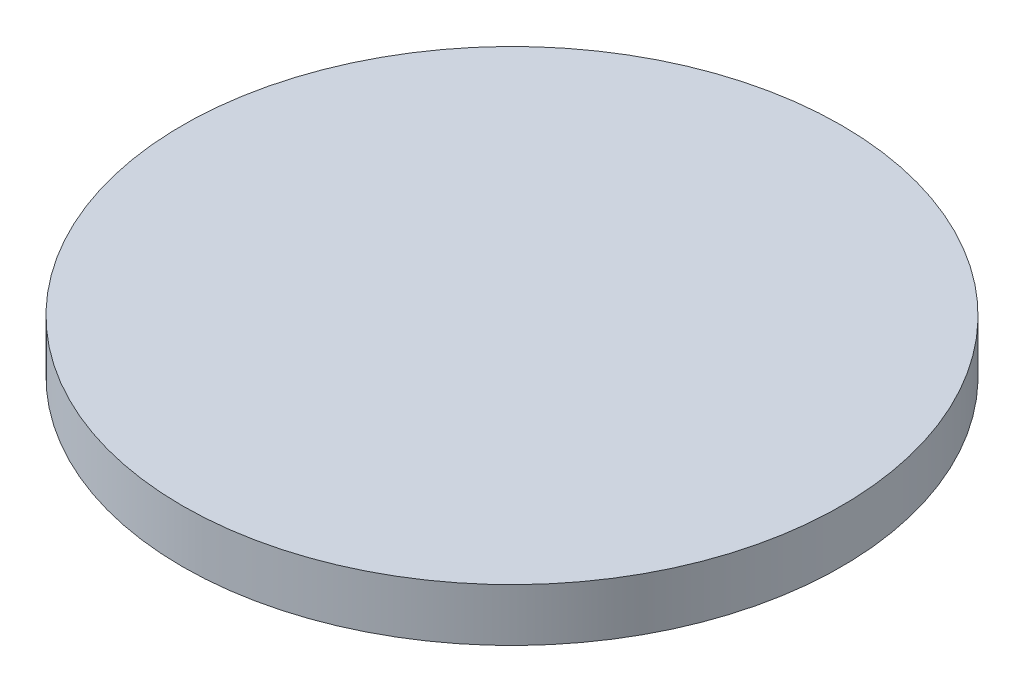
ISO-10303-21;
HEADER;
FILE_DESCRIPTION(('STEP AP214'),'2;1');
FILE_NAME('part.step','',(''),(''),'','','');
FILE_SCHEMA(('AUTOMOTIVE_DESIGN { 1 0 10303 214 1 1 1 1 }'));
ENDSEC;
DATA;
#1=APPLICATION_CONTEXT('core data for automotive mechanical design processes');
#2=APPLICATION_PROTOCOL_DEFINITION('international standard','automotive_design',2000,#1);
#3=PRODUCT_CONTEXT('',#1,'mechanical');
#4=PRODUCT('Part','Part','',(#3));
#5=PRODUCT_RELATED_PRODUCT_CATEGORY('part','',(#4));
#6=PRODUCT_DEFINITION_FORMATION('','',#4);
#7=PRODUCT_DEFINITION_CONTEXT('part definition',#1,'design');
#8=PRODUCT_DEFINITION('design','',#6,#7);
#9=PRODUCT_DEFINITION_SHAPE('','',#8);
#10=(LENGTH_UNIT() NAMED_UNIT(*) SI_UNIT(.MILLI.,.METRE.));
#11=(NAMED_UNIT(*) PLANE_ANGLE_UNIT() SI_UNIT($,.RADIAN.));
#12=(NAMED_UNIT(*) SI_UNIT($,.STERADIAN.) SOLID_ANGLE_UNIT());
#13=UNCERTAINTY_MEASURE_WITH_UNIT(LENGTH_MEASURE(1.E-05),#10,'distance_accuracy_value','');
#14=(GEOMETRIC_REPRESENTATION_CONTEXT(3) GLOBAL_UNCERTAINTY_ASSIGNED_CONTEXT((#13)) GLOBAL_UNIT_ASSIGNED_CONTEXT((#10,
#11,#12)) REPRESENTATION_CONTEXT('',''));
#15=CARTESIAN_POINT('',(0.,0.,0.));
#16=DIRECTION('',(0.,0.,1.));
#17=DIRECTION('',(1.,0.,0.));
#18=AXIS2_PLACEMENT_3D('',#15,#16,#17);
#19=CARTESIAN_POINT('',(0.,1.6,0.));
#20=DIRECTION('',(0.,-1.,0.));
#21=DIRECTION('',(0.,0.,-1.));
#22=AXIS2_PLACEMENT_3D('',#19,#20,#21);
#23=CYLINDRICAL_SURFACE('',#22,10.);
#24=CARTESIAN_POINT('',(0.,1.6,0.));
#25=DIRECTION('',(0.,1.,0.));
#26=DIRECTION('',(0.,0.,1.));
#27=AXIS2_PLACEMENT_3D('',#24,#25,#26);
#28=CIRCLE('',#27,10.);
#29=CARTESIAN_POINT('',(0.,1.6,10.));
#30=VERTEX_POINT('',#29);
#31=EDGE_CURVE('E10',#30,#30,#28,.T.);
#32=ORIENTED_EDGE('',*,*,#31,.F.);
#33=EDGE_LOOP('',(#32));
#34=FACE_BOUND('',#33,.T.);
#35=CARTESIAN_POINT('',(0.,0.,0.));
#36=DIRECTION('',(0.,1.,0.));
#37=DIRECTION('',(0.,0.,1.));
#38=AXIS2_PLACEMENT_3D('',#35,#36,#37);
#39=CIRCLE('',#38,10.);
#40=CARTESIAN_POINT('',(0.,0.,10.));
#41=VERTEX_POINT('',#40);
#42=EDGE_CURVE('E34',#41,#41,#39,.T.);
#43=ORIENTED_EDGE('',*,*,#42,.T.);
#44=EDGE_LOOP('',(#43));
#45=FACE_BOUND('',#44,.T.);
#46=ADVANCED_FACE('F31',(#34,#45),#23,.T.);
#47=CARTESIAN_POINT('',(0.,1.6,0.));
#48=DIRECTION('',(0.,1.,0.));
#49=DIRECTION('',(0.,0.,1.));
#50=AXIS2_PLACEMENT_3D('',#47,#48,#49);
#51=PLANE('',#50);
#52=ORIENTED_EDGE('',*,*,#31,.T.);
#53=EDGE_LOOP('',(#52));
#54=FACE_BOUND('',#53,.T.);
#55=ADVANCED_FACE('F46',(#54),#51,.T.);
#56=CARTESIAN_POINT('',(0.,0.,0.));
#57=DIRECTION('',(0.,1.,0.));
#58=DIRECTION('',(0.,0.,1.));
#59=AXIS2_PLACEMENT_3D('',#56,#57,#58);
#60=PLANE('',#59);
#61=ORIENTED_EDGE('',*,*,#42,.F.);
#62=EDGE_LOOP('',(#61));
#63=FACE_BOUND('',#62,.T.);
#64=ADVANCED_FACE('F44',(#63),#60,.F.);
#65=CLOSED_SHELL('',(#46,#55,#64));
#66=MANIFOLD_SOLID_BREP('B2',#65);
#67=ADVANCED_BREP_SHAPE_REPRESENTATION('',(#18,#66),#14);
#68=SHAPE_DEFINITION_REPRESENTATION(#9,#67);
ENDSEC;
END-ISO-10303-21;
